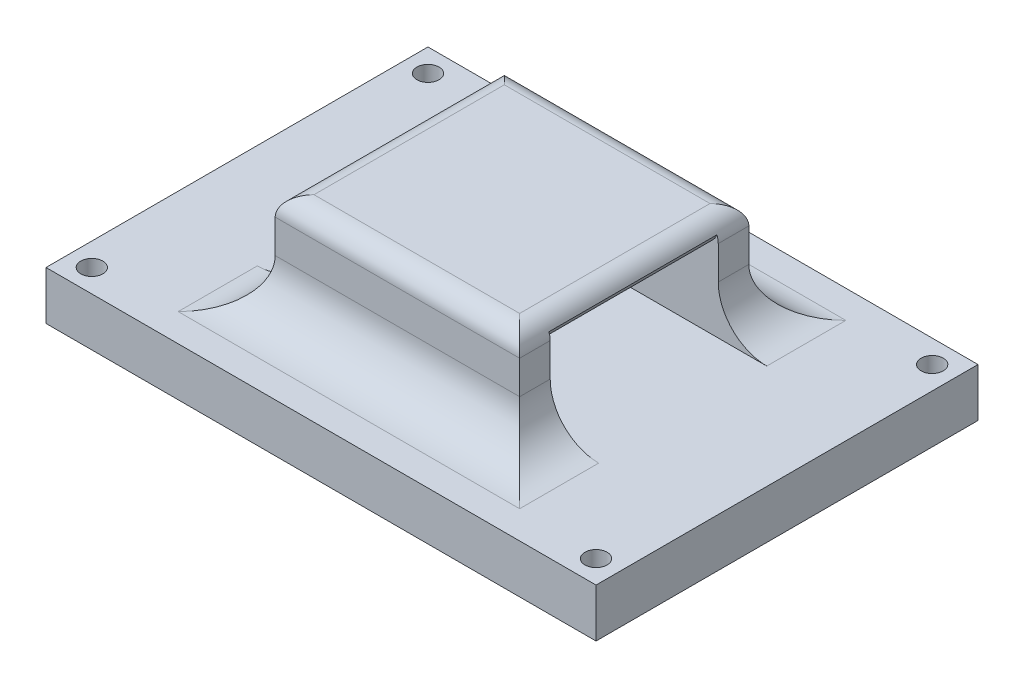
ISO-10303-21;
HEADER;
FILE_DESCRIPTION(('STEP AP214'),'2;1');
FILE_NAME('part.step','',(''),(''),'','','');
FILE_SCHEMA(('AUTOMOTIVE_DESIGN { 1 0 10303 214 1 1 1 1 }'));
ENDSEC;
DATA;
#1=APPLICATION_CONTEXT('core data for automotive mechanical design processes');
#2=APPLICATION_PROTOCOL_DEFINITION('international standard','automotive_design',2000,#1);
#3=PRODUCT_CONTEXT('',#1,'mechanical');
#4=PRODUCT('Part','Part','',(#3));
#5=PRODUCT_RELATED_PRODUCT_CATEGORY('part','',(#4));
#6=PRODUCT_DEFINITION_FORMATION('','',#4);
#7=PRODUCT_DEFINITION_CONTEXT('part definition',#1,'design');
#8=PRODUCT_DEFINITION('design','',#6,#7);
#9=PRODUCT_DEFINITION_SHAPE('','',#8);
#10=(LENGTH_UNIT() NAMED_UNIT(*) SI_UNIT(.MILLI.,.METRE.));
#11=(NAMED_UNIT(*) PLANE_ANGLE_UNIT() SI_UNIT($,.RADIAN.));
#12=(NAMED_UNIT(*) SI_UNIT($,.STERADIAN.) SOLID_ANGLE_UNIT());
#13=UNCERTAINTY_MEASURE_WITH_UNIT(LENGTH_MEASURE(1.E-05),#10,'distance_accuracy_value','');
#14=(GEOMETRIC_REPRESENTATION_CONTEXT(3) GLOBAL_UNCERTAINTY_ASSIGNED_CONTEXT((#13)) GLOBAL_UNIT_ASSIGNED_CONTEXT((#10,
#11,#12)) REPRESENTATION_CONTEXT('',''));
#15=CARTESIAN_POINT('',(0.,0.,0.));
#16=DIRECTION('',(0.,0.,1.));
#17=DIRECTION('',(1.,0.,0.));
#18=AXIS2_PLACEMENT_3D('',#15,#16,#17);
#19=CARTESIAN_POINT('',(32.,0.,0.));
#20=DIRECTION('',(-1.,0.,0.));
#21=DIRECTION('',(0.,0.,1.));
#22=AXIS2_PLACEMENT_3D('',#19,#20,#21);
#23=PLANE('',#22);
#24=DIRECTION('',(0.,-1.,0.));
#25=VECTOR('',#24,1.);
#26=CARTESIAN_POINT('',(32.,-5.,11.));
#27=LINE('',#26,#25);
#28=CARTESIAN_POINT('',(32.,5.71,11.));
#29=VERTEX_POINT('',#28);
#30=CARTESIAN_POINT('',(32.,1.35,11.));
#31=VERTEX_POINT('',#30);
#32=EDGE_CURVE('E55',#29,#31,#27,.T.);
#33=ORIENTED_EDGE('',*,*,#32,.F.);
#34=DIRECTION('',(0.,0.,1.));
#35=VECTOR('',#34,1.);
#36=CARTESIAN_POINT('',(32.,5.71,0.));
#37=LINE('',#36,#35);
#38=CARTESIAN_POINT('',(32.,5.71,15.));
#39=VERTEX_POINT('',#38);
#40=EDGE_CURVE('E347',#29,#39,#37,.T.);
#41=ORIENTED_EDGE('',*,*,#40,.T.);
#42=DIRECTION('',(0.,-1.,0.));
#43=VECTOR('',#42,1.);
#44=CARTESIAN_POINT('',(32.,-11.35,15.));
#45=LINE('',#44,#43);
#46=CARTESIAN_POINT('',(32.,1.35,15.));
#47=VERTEX_POINT('',#46);
#48=EDGE_CURVE('E267',#39,#47,#45,.T.);
#49=ORIENTED_EDGE('',*,*,#48,.T.);
#50=DIRECTION('',(0.,0.,-1.));
#51=VECTOR('',#50,1.);
#52=CARTESIAN_POINT('',(32.,1.35,0.));
#53=LINE('',#52,#51);
#54=EDGE_CURVE('E292',#47,#31,#53,.T.);
#55=ORIENTED_EDGE('',*,*,#54,.T.);
#56=EDGE_LOOP('',(#33,#41,#49,#55));
#57=FACE_BOUND('',#56,.T.);
#58=ADVANCED_FACE('F39',(#57),#23,.F.);
#59=CARTESIAN_POINT('',(0.,0.,0.));
#60=DIRECTION('',(-1.,0.,0.));
#61=DIRECTION('',(0.,0.,1.));
#62=AXIS2_PLACEMENT_3D('',#59,#60,#61);
#63=PLANE('',#62);
#64=DIRECTION('',(0.,0.,1.));
#65=VECTOR('',#64,1.);
#66=CARTESIAN_POINT('',(0.,5.71,-15.));
#67=LINE('',#66,#65);
#68=CARTESIAN_POINT('',(0.,5.71,15.));
#69=VERTEX_POINT('',#68);
#70=CARTESIAN_POINT('',(0.,5.71,11.));
#71=VERTEX_POINT('',#70);
#72=EDGE_CURVE('E386',#69,#71,#67,.F.);
#73=ORIENTED_EDGE('',*,*,#72,.T.);
#74=DIRECTION('',(0.,-1.,0.));
#75=VECTOR('',#74,1.);
#76=CARTESIAN_POINT('',(0.,-5.,11.));
#77=LINE('',#76,#75);
#78=CARTESIAN_POINT('',(0.,1.35,11.));
#79=VERTEX_POINT('',#78);
#80=EDGE_CURVE('E240',#71,#79,#77,.T.);
#81=ORIENTED_EDGE('',*,*,#80,.T.);
#82=DIRECTION('',(0.,0.,-1.));
#83=VECTOR('',#82,1.);
#84=CARTESIAN_POINT('',(0.,1.35,15.));
#85=LINE('',#84,#83);
#86=CARTESIAN_POINT('',(0.,1.35,15.));
#87=VERTEX_POINT('',#86);
#88=EDGE_CURVE('E322',#79,#87,#85,.F.);
#89=ORIENTED_EDGE('',*,*,#88,.T.);
#90=DIRECTION('',(0.,-1.,0.));
#91=VECTOR('',#90,1.);
#92=CARTESIAN_POINT('',(0.,-11.35,15.));
#93=LINE('',#92,#91);
#94=EDGE_CURVE('E268',#69,#87,#93,.T.);
#95=ORIENTED_EDGE('',*,*,#94,.F.);
#96=EDGE_LOOP('',(#73,#81,#89,#95));
#97=FACE_BOUND('',#96,.T.);
#98=ADVANCED_FACE('F502',(#97),#63,.T.);
#99=CARTESIAN_POINT('',(49.000000014,-15.451219330882,-21.999994072));
#100=DIRECTION('',(0.,1.,0.));
#101=DIRECTION('',(0.,0.,1.));
#102=AXIS2_PLACEMENT_3D('',#99,#100,#101);
#103=CYLINDRICAL_SURFACE('',#102,1.45);
#104=CARTESIAN_POINT('',(49.000000014,-11.35,-21.999994072));
#105=DIRECTION('',(0.,1.,0.));
#106=DIRECTION('',(0.,0.,1.));
#107=AXIS2_PLACEMENT_3D('',#104,#105,#106);
#108=CIRCLE('',#107,1.45);
#109=CARTESIAN_POINT('',(49.000000014,-11.35,-20.549994072));
#110=VERTEX_POINT('',#109);
#111=EDGE_CURVE('E284',#110,#110,#108,.F.);
#112=ORIENTED_EDGE('',*,*,#111,.T.);
#113=EDGE_LOOP('',(#112));
#114=FACE_BOUND('',#113,.T.);
#115=CARTESIAN_POINT('',(49.000000014,-5.,-21.999994072));
#116=DIRECTION('',(0.,1.,0.));
#117=DIRECTION('',(0.,0.,1.));
#118=AXIS2_PLACEMENT_3D('',#115,#116,#117);
#119=CIRCLE('',#118,1.45);
#120=CARTESIAN_POINT('',(49.000000014,-5.,-20.549994072));
#121=VERTEX_POINT('',#120);
#122=EDGE_CURVE('E288',#121,#121,#119,.T.);
#123=ORIENTED_EDGE('',*,*,#122,.T.);
#124=EDGE_LOOP('',(#123));
#125=FACE_BOUND('',#124,.T.);
#126=ADVANCED_FACE('F551',(#114,#125),#103,.F.);
#127=CARTESIAN_POINT('',(-17.,-15.451219330882,-21.999994072));
#128=DIRECTION('',(0.,1.,0.));
#129=DIRECTION('',(0.,0.,1.));
#130=AXIS2_PLACEMENT_3D('',#127,#128,#129);
#131=CYLINDRICAL_SURFACE('',#130,1.45);
#132=CARTESIAN_POINT('',(-17.,-11.35,-21.999994072));
#133=DIRECTION('',(0.,1.,0.));
#134=DIRECTION('',(0.,0.,1.));
#135=AXIS2_PLACEMENT_3D('',#132,#133,#134);
#136=CIRCLE('',#135,1.45);
#137=CARTESIAN_POINT('',(-17.,-11.35,-20.549994072));
#138=VERTEX_POINT('',#137);
#139=EDGE_CURVE('E271',#138,#138,#136,.F.);
#140=ORIENTED_EDGE('',*,*,#139,.T.);
#141=EDGE_LOOP('',(#140));
#142=FACE_BOUND('',#141,.T.);
#143=CARTESIAN_POINT('',(-17.,-5.,-21.999994072));
#144=DIRECTION('',(0.,1.,0.));
#145=DIRECTION('',(0.,0.,1.));
#146=AXIS2_PLACEMENT_3D('',#143,#144,#145);
#147=CIRCLE('',#146,1.45);
#148=CARTESIAN_POINT('',(-17.,-5.,-20.549994072));
#149=VERTEX_POINT('',#148);
#150=EDGE_CURVE('E280',#149,#149,#147,.T.);
#151=ORIENTED_EDGE('',*,*,#150,.T.);
#152=EDGE_LOOP('',(#151));
#153=FACE_BOUND('',#152,.T.);
#154=ADVANCED_FACE('F555',(#142,#153),#131,.F.);
#155=CARTESIAN_POINT('',(32.,5.71,-15.));
#156=VERTEX_POINT('',#155);
#157=CARTESIAN_POINT('',(32.,5.71,-11.));
#158=VERTEX_POINT('',#157);
#159=EDGE_CURVE('E365',#156,#158,#37,.T.);
#160=ORIENTED_EDGE('',*,*,#159,.T.);
#161=DIRECTION('',(0.,1.,0.));
#162=VECTOR('',#161,1.);
#163=CARTESIAN_POINT('',(32.,-5.,-11.));
#164=LINE('',#163,#162);
#165=CARTESIAN_POINT('',(32.,1.35,-11.));
#166=VERTEX_POINT('',#165);
#167=EDGE_CURVE('E237',#166,#158,#164,.T.);
#168=ORIENTED_EDGE('',*,*,#167,.F.);
#169=DIRECTION('',(0.,0.,-1.));
#170=VECTOR('',#169,1.);
#171=CARTESIAN_POINT('',(32.,1.35,0.));
#172=LINE('',#171,#170);
#173=CARTESIAN_POINT('',(32.,1.35,-15.));
#174=VERTEX_POINT('',#173);
#175=EDGE_CURVE('E295',#166,#174,#172,.T.);
#176=ORIENTED_EDGE('',*,*,#175,.T.);
#177=DIRECTION('',(0.,1.,0.));
#178=VECTOR('',#177,1.);
#179=CARTESIAN_POINT('',(32.,-11.35,-15.));
#180=LINE('',#179,#178);
#181=EDGE_CURVE('E263',#174,#156,#180,.T.);
#182=ORIENTED_EDGE('',*,*,#181,.T.);
#183=EDGE_LOOP('',(#160,#168,#176,#182));
#184=FACE_BOUND('',#183,.T.);
#185=ADVANCED_FACE('F515',(#184),#23,.F.);
#186=DIRECTION('',(0.,1.,0.));
#187=VECTOR('',#186,1.);
#188=CARTESIAN_POINT('',(0.,-5.,-11.));
#189=LINE('',#188,#187);
#190=CARTESIAN_POINT('',(0.,1.35,-11.));
#191=VERTEX_POINT('',#190);
#192=CARTESIAN_POINT('',(0.,5.71,-11.));
#193=VERTEX_POINT('',#192);
#194=EDGE_CURVE('E63',#191,#193,#189,.T.);
#195=ORIENTED_EDGE('',*,*,#194,.T.);
#196=CARTESIAN_POINT('',(0.,5.71,-15.));
#197=VERTEX_POINT('',#196);
#198=EDGE_CURVE('E385',#193,#197,#67,.F.);
#199=ORIENTED_EDGE('',*,*,#198,.T.);
#200=DIRECTION('',(0.,1.,0.));
#201=VECTOR('',#200,1.);
#202=CARTESIAN_POINT('',(0.,-11.35,-15.));
#203=LINE('',#202,#201);
#204=CARTESIAN_POINT('',(0.,1.35,-15.));
#205=VERTEX_POINT('',#204);
#206=EDGE_CURVE('E262',#205,#197,#203,.T.);
#207=ORIENTED_EDGE('',*,*,#206,.F.);
#208=DIRECTION('',(0.,0.,-1.));
#209=VECTOR('',#208,1.);
#210=CARTESIAN_POINT('',(0.,1.35,-11.));
#211=LINE('',#210,#209);
#212=EDGE_CURVE('E319',#205,#191,#211,.F.);
#213=ORIENTED_EDGE('',*,*,#212,.T.);
#214=EDGE_LOOP('',(#195,#199,#207,#213));
#215=FACE_BOUND('',#214,.T.);
#216=ADVANCED_FACE('F529',(#215),#63,.T.);
#217=CARTESIAN_POINT('',(32.,-11.35,-15.));
#218=DIRECTION('',(0.,0.,1.));
#219=DIRECTION('',(1.,0.,0.));
#220=AXIS2_PLACEMENT_3D('',#217,#218,#219);
#221=PLANE('',#220);
#222=ORIENTED_EDGE('',*,*,#206,.T.);
#223=DIRECTION('',(-1.,0.,0.));
#224=VECTOR('',#223,1.);
#225=CARTESIAN_POINT('',(32.,5.71,-15.));
#226=LINE('',#225,#224);
#227=EDGE_CURVE('E382',#197,#156,#226,.F.);
#228=ORIENTED_EDGE('',*,*,#227,.T.);
#229=ORIENTED_EDGE('',*,*,#181,.F.);
#230=DIRECTION('',(-1.,0.,0.));
#231=VECTOR('',#230,1.);
#232=CARTESIAN_POINT('',(32.,1.35,-15.));
#233=LINE('',#232,#231);
#234=EDGE_CURVE('E326',#174,#205,#233,.T.);
#235=ORIENTED_EDGE('',*,*,#234,.T.);
#236=EDGE_LOOP('',(#222,#228,#229,#235));
#237=FACE_BOUND('',#236,.T.);
#238=ADVANCED_FACE('F513',(#237),#221,.F.);
#239=CARTESIAN_POINT('',(32.,8.25,15.));
#240=DIRECTION('',(0.,-1.,0.));
#241=DIRECTION('',(0.,0.,-1.));
#242=AXIS2_PLACEMENT_3D('',#239,#240,#241);
#243=PLANE('',#242);
#244=DIRECTION('',(-1.,0.,0.));
#245=VECTOR('',#244,1.);
#246=CARTESIAN_POINT('',(32.,8.25,12.46));
#247=LINE('',#246,#245);
#248=CARTESIAN_POINT('',(2.54,8.25,12.46));
#249=VERTEX_POINT('',#248);
#250=CARTESIAN_POINT('',(29.46,8.25,12.46));
#251=VERTEX_POINT('',#250);
#252=EDGE_CURVE('E369',#249,#251,#247,.F.);
#253=ORIENTED_EDGE('',*,*,#252,.T.);
#254=DIRECTION('',(0.,0.,1.));
#255=VECTOR('',#254,1.);
#256=CARTESIAN_POINT('',(29.46,8.25,15.));
#257=LINE('',#256,#255);
#258=CARTESIAN_POINT('',(29.46,8.25,-12.46));
#259=VERTEX_POINT('',#258);
#260=EDGE_CURVE('E378',#251,#259,#257,.F.);
#261=ORIENTED_EDGE('',*,*,#260,.T.);
#262=DIRECTION('',(-1.,0.,0.));
#263=VECTOR('',#262,1.);
#264=CARTESIAN_POINT('',(32.,8.25,-12.46));
#265=LINE('',#264,#263);
#266=CARTESIAN_POINT('',(2.54,8.25,-12.46));
#267=VERTEX_POINT('',#266);
#268=EDGE_CURVE('E375',#259,#267,#265,.T.);
#269=ORIENTED_EDGE('',*,*,#268,.T.);
#270=DIRECTION('',(0.,0.,1.));
#271=VECTOR('',#270,1.);
#272=CARTESIAN_POINT('',(2.54,8.25,15.));
#273=LINE('',#272,#271);
#274=EDGE_CURVE('E372',#267,#249,#273,.T.);
#275=ORIENTED_EDGE('',*,*,#274,.T.);
#276=EDGE_LOOP('',(#253,#261,#269,#275));
#277=FACE_BOUND('',#276,.T.);
#278=ADVANCED_FACE('F505',(#277),#243,.F.);
#279=CARTESIAN_POINT('',(32.,-11.35,15.));
#280=DIRECTION('',(0.,0.,-1.));
#281=DIRECTION('',(-1.,0.,0.));
#282=AXIS2_PLACEMENT_3D('',#279,#280,#281);
#283=PLANE('',#282);
#284=ORIENTED_EDGE('',*,*,#48,.F.);
#285=DIRECTION('',(-1.,0.,0.));
#286=VECTOR('',#285,1.);
#287=CARTESIAN_POINT('',(32.,5.71,15.));
#288=LINE('',#287,#286);
#289=EDGE_CURVE('E390',#39,#69,#288,.T.);
#290=ORIENTED_EDGE('',*,*,#289,.T.);
#291=ORIENTED_EDGE('',*,*,#94,.T.);
#292=DIRECTION('',(1.,0.,0.));
#293=VECTOR('',#292,1.);
#294=CARTESIAN_POINT('',(32.,1.35,15.));
#295=LINE('',#294,#293);
#296=EDGE_CURVE('E329',#87,#47,#295,.T.);
#297=ORIENTED_EDGE('',*,*,#296,.T.);
#298=EDGE_LOOP('',(#284,#290,#291,#297));
#299=FACE_BOUND('',#298,.T.);
#300=ADVANCED_FACE('F484',(#299),#283,.F.);
#301=CARTESIAN_POINT('',(32.,-5.,-11.));
#302=DIRECTION('',(0.,0.,1.));
#303=DIRECTION('',(1.,0.,0.));
#304=AXIS2_PLACEMENT_3D('',#301,#302,#303);
#305=PLANE('',#304);
#306=ORIENTED_EDGE('',*,*,#194,.F.);
#307=CARTESIAN_POINT('',(-6.35,1.35,-11.));
#308=DIRECTION('',(0.,0.,1.));
#309=DIRECTION('',(1.,0.,0.));
#310=AXIS2_PLACEMENT_3D('',#307,#308,#309);
#311=CIRCLE('',#310,6.35);
#312=CARTESIAN_POINT('',(-6.35,-5.,-11.));
#313=VERTEX_POINT('',#312);
#314=EDGE_CURVE('E343',#191,#313,#311,.F.);
#315=ORIENTED_EDGE('',*,*,#314,.T.);
#316=DIRECTION('',(-1.,0.,0.));
#317=VECTOR('',#316,1.);
#318=CARTESIAN_POINT('',(32.,-5.,-11.));
#319=LINE('',#318,#317);
#320=CARTESIAN_POINT('',(38.35,-5.,-11.));
#321=VERTEX_POINT('',#320);
#322=EDGE_CURVE('E243',#321,#313,#319,.T.);
#323=ORIENTED_EDGE('',*,*,#322,.F.);
#324=CARTESIAN_POINT('',(38.35,1.35,-11.));
#325=DIRECTION('',(0.,0.,1.));
#326=DIRECTION('',(1.,0.,0.));
#327=AXIS2_PLACEMENT_3D('',#324,#325,#326);
#328=CIRCLE('',#327,6.35);
#329=EDGE_CURVE('E333',#321,#166,#328,.F.);
#330=ORIENTED_EDGE('',*,*,#329,.T.);
#331=ORIENTED_EDGE('',*,*,#167,.T.);
#332=CARTESIAN_POINT('',(29.46,5.71,-11.));
#333=DIRECTION('',(0.,0.,1.));
#334=DIRECTION('',(1.,0.,0.));
#335=AXIS2_PLACEMENT_3D('',#332,#333,#334);
#336=CIRCLE('',#335,2.54);
#337=CARTESIAN_POINT('',(31.8294672396976,6.625,-11.));
#338=VERTEX_POINT('',#337);
#339=EDGE_CURVE('E431',#338,#158,#336,.F.);
#340=ORIENTED_EDGE('',*,*,#339,.F.);
#341=CARTESIAN_POINT('',(29.46,7.54,-11.));
#342=DIRECTION('',(0.,0.,1.));
#343=DIRECTION('',(1.,0.,0.));
#344=AXIS2_PLACEMENT_3D('',#341,#342,#343);
#345=CIRCLE('',#344,2.54);
#346=CARTESIAN_POINT('',(29.46,5.,-11.));
#347=VERTEX_POINT('',#346);
#348=EDGE_CURVE('E11',#338,#347,#345,.F.);
#349=ORIENTED_EDGE('',*,*,#348,.T.);
#350=DIRECTION('',(-1.,0.,0.));
#351=VECTOR('',#350,1.);
#352=CARTESIAN_POINT('',(32.,5.,-11.));
#353=LINE('',#352,#351);
#354=CARTESIAN_POINT('',(2.54,5.,-11.));
#355=VERTEX_POINT('',#354);
#356=EDGE_CURVE('E258',#347,#355,#353,.T.);
#357=ORIENTED_EDGE('',*,*,#356,.T.);
#358=CARTESIAN_POINT('',(2.54,7.54,-11.));
#359=DIRECTION('',(0.,0.,1.));
#360=DIRECTION('',(1.,0.,0.));
#361=AXIS2_PLACEMENT_3D('',#358,#359,#360);
#362=CIRCLE('',#361,2.54);
#363=CARTESIAN_POINT('',(0.170532760302435,6.625,-11.));
#364=VERTEX_POINT('',#363);
#365=EDGE_CURVE('E442',#355,#364,#362,.F.);
#366=ORIENTED_EDGE('',*,*,#365,.T.);
#367=CARTESIAN_POINT('',(2.54,5.71,-11.));
#368=DIRECTION('',(0.,0.,1.));
#369=DIRECTION('',(1.,0.,0.));
#370=AXIS2_PLACEMENT_3D('',#367,#368,#369);
#371=CIRCLE('',#370,2.54);
#372=EDGE_CURVE('E393',#193,#364,#371,.F.);
#373=ORIENTED_EDGE('',*,*,#372,.F.);
#374=EDGE_LOOP('',(#306,#315,#323,#330,#331,#340,#349,#357,#366,#373));
#375=FACE_BOUND('',#374,.T.);
#376=ADVANCED_FACE('F457',(#375),#305,.T.);
#377=CARTESIAN_POINT('',(32.,5.,11.));
#378=DIRECTION('',(0.,-1.,0.));
#379=DIRECTION('',(0.,0.,-1.));
#380=AXIS2_PLACEMENT_3D('',#377,#378,#379);
#381=PLANE('',#380);
#382=DIRECTION('',(-1.,0.,0.));
#383=VECTOR('',#382,1.);
#384=CARTESIAN_POINT('',(32.,5.,11.));
#385=LINE('',#384,#383);
#386=CARTESIAN_POINT('',(29.46,5.,11.));
#387=VERTEX_POINT('',#386);
#388=CARTESIAN_POINT('',(2.54,5.,11.));
#389=VERTEX_POINT('',#388);
#390=EDGE_CURVE('E254',#387,#389,#385,.T.);
#391=ORIENTED_EDGE('',*,*,#390,.T.);
#392=DIRECTION('',(0.,0.,1.));
#393=VECTOR('',#392,1.);
#394=CARTESIAN_POINT('',(2.54,5.,11.));
#395=LINE('',#394,#393);
#396=EDGE_CURVE('E423',#389,#355,#395,.F.);
#397=ORIENTED_EDGE('',*,*,#396,.T.);
#398=ORIENTED_EDGE('',*,*,#356,.F.);
#399=DIRECTION('',(0.,0.,1.));
#400=VECTOR('',#399,1.);
#401=CARTESIAN_POINT('',(29.46,5.,11.));
#402=LINE('',#401,#400);
#403=EDGE_CURVE('E419',#347,#387,#402,.T.);
#404=ORIENTED_EDGE('',*,*,#403,.T.);
#405=EDGE_LOOP('',(#391,#397,#398,#404));
#406=FACE_BOUND('',#405,.T.);
#407=ADVANCED_FACE('F459',(#406),#381,.T.);
#408=CARTESIAN_POINT('',(32.,-5.,11.));
#409=DIRECTION('',(0.,0.,-1.));
#410=DIRECTION('',(-1.,0.,0.));
#411=AXIS2_PLACEMENT_3D('',#408,#409,#410);
#412=PLANE('',#411);
#413=ORIENTED_EDGE('',*,*,#80,.F.);
#414=CARTESIAN_POINT('',(2.54,5.71,11.));
#415=DIRECTION('',(0.,0.,-1.));
#416=DIRECTION('',(-1.,0.,0.));
#417=AXIS2_PLACEMENT_3D('',#414,#415,#416);
#418=CIRCLE('',#417,2.54);
#419=CARTESIAN_POINT('',(0.170532760302435,6.625,11.));
#420=VERTEX_POINT('',#419);
#421=EDGE_CURVE('E415',#420,#71,#418,.F.);
#422=ORIENTED_EDGE('',*,*,#421,.F.);
#423=CARTESIAN_POINT('',(2.54,7.54,11.));
#424=DIRECTION('',(0.,0.,-1.));
#425=DIRECTION('',(-1.,0.,0.));
#426=AXIS2_PLACEMENT_3D('',#423,#424,#425);
#427=CIRCLE('',#426,2.54);
#428=EDGE_CURVE('E439',#420,#389,#427,.F.);
#429=ORIENTED_EDGE('',*,*,#428,.T.);
#430=ORIENTED_EDGE('',*,*,#390,.F.);
#431=CARTESIAN_POINT('',(29.46,7.54,11.));
#432=DIRECTION('',(0.,0.,-1.));
#433=DIRECTION('',(-1.,0.,0.));
#434=AXIS2_PLACEMENT_3D('',#431,#432,#433);
#435=CIRCLE('',#434,2.54);
#436=CARTESIAN_POINT('',(31.8294672396976,6.625,11.));
#437=VERTEX_POINT('',#436);
#438=EDGE_CURVE('E48',#387,#437,#435,.F.);
#439=ORIENTED_EDGE('',*,*,#438,.T.);
#440=CARTESIAN_POINT('',(29.46,5.71,11.));
#441=DIRECTION('',(0.,0.,-1.));
#442=DIRECTION('',(-1.,0.,0.));
#443=AXIS2_PLACEMENT_3D('',#440,#441,#442);
#444=CIRCLE('',#443,2.54);
#445=EDGE_CURVE('E435',#29,#437,#444,.F.);
#446=ORIENTED_EDGE('',*,*,#445,.F.);
#447=ORIENTED_EDGE('',*,*,#32,.T.);
#448=CARTESIAN_POINT('',(38.35,1.35,11.));
#449=DIRECTION('',(0.,0.,-1.));
#450=DIRECTION('',(-1.,0.,0.));
#451=AXIS2_PLACEMENT_3D('',#448,#449,#450);
#452=CIRCLE('',#451,6.35);
#453=CARTESIAN_POINT('',(38.35,-5.,11.));
#454=VERTEX_POINT('',#453);
#455=EDGE_CURVE('E336',#31,#454,#452,.F.);
#456=ORIENTED_EDGE('',*,*,#455,.T.);
#457=DIRECTION('',(-1.,0.,0.));
#458=VECTOR('',#457,1.);
#459=CARTESIAN_POINT('',(32.,-5.,11.));
#460=LINE('',#459,#458);
#461=CARTESIAN_POINT('',(-6.35,-5.,11.));
#462=VERTEX_POINT('',#461);
#463=EDGE_CURVE('E251',#454,#462,#460,.T.);
#464=ORIENTED_EDGE('',*,*,#463,.T.);
#465=CARTESIAN_POINT('',(-6.35,1.35,11.));
#466=DIRECTION('',(0.,0.,-1.));
#467=DIRECTION('',(-1.,0.,0.));
#468=AXIS2_PLACEMENT_3D('',#465,#466,#467);
#469=CIRCLE('',#468,6.35);
#470=EDGE_CURVE('E340',#462,#79,#469,.F.);
#471=ORIENTED_EDGE('',*,*,#470,.T.);
#472=EDGE_LOOP('',(#413,#422,#429,#430,#439,#446,#447,#456,#464,#471));
#473=FACE_BOUND('',#472,.T.);
#474=ADVANCED_FACE('F447',(#473),#412,.T.);
#475=CARTESIAN_POINT('',(32.,-5.,11.));
#476=DIRECTION('',(0.,1.,0.));
#477=DIRECTION('',(0.,0.,1.));
#478=AXIS2_PLACEMENT_3D('',#475,#476,#477);
#479=PLANE('',#478);
#480=CARTESIAN_POINT('',(49.000000014,-5.,22.000006));
#481=DIRECTION('',(0.,1.,0.));
#482=DIRECTION('',(0.,0.,1.));
#483=AXIS2_PLACEMENT_3D('',#480,#481,#482);
#484=CIRCLE('',#483,1.45);
#485=CARTESIAN_POINT('',(49.000000014,-5.,23.450006));
#486=VERTEX_POINT('',#485);
#487=EDGE_CURVE('E824',#486,#486,#484,.T.);
#488=ORIENTED_EDGE('',*,*,#487,.F.);
#489=EDGE_LOOP('',(#488));
#490=FACE_BOUND('',#489,.T.);
#491=CARTESIAN_POINT('',(-17.,-5.,22.000006));
#492=DIRECTION('',(0.,1.,0.));
#493=DIRECTION('',(0.,0.,1.));
#494=AXIS2_PLACEMENT_3D('',#491,#492,#493);
#495=CIRCLE('',#494,1.45);
#496=CARTESIAN_POINT('',(-17.,-5.,23.450006));
#497=VERTEX_POINT('',#496);
#498=EDGE_CURVE('E820',#497,#497,#495,.T.);
#499=ORIENTED_EDGE('',*,*,#498,.F.);
#500=EDGE_LOOP('',(#499));
#501=FACE_BOUND('',#500,.T.);
#502=DIRECTION('',(0.,0.,-1.));
#503=VECTOR('',#502,1.);
#504=CARTESIAN_POINT('',(38.35,-5.,11.));
#505=LINE('',#504,#503);
#506=CARTESIAN_POINT('',(38.35,-5.,-21.35));
#507=VERTEX_POINT('',#506);
#508=EDGE_CURVE('E315',#507,#321,#505,.F.);
#509=ORIENTED_EDGE('',*,*,#508,.T.);
#510=ORIENTED_EDGE('',*,*,#322,.T.);
#511=DIRECTION('',(0.,0.,-1.));
#512=VECTOR('',#511,1.);
#513=CARTESIAN_POINT('',(-6.35,-5.,-15.));
#514=LINE('',#513,#512);
#515=CARTESIAN_POINT('',(-6.35,-5.,-21.35));
#516=VERTEX_POINT('',#515);
#517=EDGE_CURVE('E312',#313,#516,#514,.T.);
#518=ORIENTED_EDGE('',*,*,#517,.T.);
#519=DIRECTION('',(-1.,0.,0.));
#520=VECTOR('',#519,1.);
#521=CARTESIAN_POINT('',(32.,-5.,-21.35));
#522=LINE('',#521,#520);
#523=EDGE_CURVE('E309',#516,#507,#522,.F.);
#524=ORIENTED_EDGE('',*,*,#523,.T.);
#525=EDGE_LOOP('',(#509,#510,#518,#524));
#526=FACE_BOUND('',#525,.T.);
#527=DIRECTION('',(0.,0.,-1.));
#528=VECTOR('',#527,1.);
#529=CARTESIAN_POINT('',(-6.35,-5.,11.));
#530=LINE('',#529,#528);
#531=CARTESIAN_POINT('',(-6.35,-5.,21.35));
#532=VERTEX_POINT('',#531);
#533=EDGE_CURVE('E302',#532,#462,#530,.T.);
#534=ORIENTED_EDGE('',*,*,#533,.T.);
#535=ORIENTED_EDGE('',*,*,#463,.F.);
#536=DIRECTION('',(0.,0.,-1.));
#537=VECTOR('',#536,1.);
#538=CARTESIAN_POINT('',(38.35,-5.,11.));
#539=LINE('',#538,#537);
#540=CARTESIAN_POINT('',(38.35,-5.,21.35));
#541=VERTEX_POINT('',#540);
#542=EDGE_CURVE('E306',#454,#541,#539,.F.);
#543=ORIENTED_EDGE('',*,*,#542,.T.);
#544=DIRECTION('',(1.,0.,0.));
#545=VECTOR('',#544,1.);
#546=CARTESIAN_POINT('',(32.,-5.,21.35));
#547=LINE('',#546,#545);
#548=EDGE_CURVE('E299',#541,#532,#547,.F.);
#549=ORIENTED_EDGE('',*,*,#548,.T.);
#550=EDGE_LOOP('',(#534,#535,#543,#549));
#551=FACE_BOUND('',#550,.T.);
#552=DIRECTION('',(0.,0.,-1.));
#553=VECTOR('',#552,1.);
#554=CARTESIAN_POINT('',(-20.,-5.,-25.));
#555=LINE('',#554,#553);
#556=CARTESIAN_POINT('',(-20.,-5.,25.));
#557=VERTEX_POINT('',#556);
#558=CARTESIAN_POINT('',(-20.,-5.,-25.));
#559=VERTEX_POINT('',#558);
#560=EDGE_CURVE('E225',#557,#559,#555,.T.);
#561=ORIENTED_EDGE('',*,*,#560,.F.);
#562=DIRECTION('',(-1.,0.,0.));
#563=VECTOR('',#562,1.);
#564=CARTESIAN_POINT('',(-20.,-5.,25.));
#565=LINE('',#564,#563);
#566=CARTESIAN_POINT('',(52.,-5.,25.));
#567=VERTEX_POINT('',#566);
#568=EDGE_CURVE('E196',#567,#557,#565,.T.);
#569=ORIENTED_EDGE('',*,*,#568,.F.);
#570=DIRECTION('',(0.,0.,1.));
#571=VECTOR('',#570,1.);
#572=CARTESIAN_POINT('',(52.,-5.,-25.));
#573=LINE('',#572,#571);
#574=CARTESIAN_POINT('',(52.,-5.,-25.));
#575=VERTEX_POINT('',#574);
#576=EDGE_CURVE('E188',#575,#567,#573,.T.);
#577=ORIENTED_EDGE('',*,*,#576,.F.);
#578=DIRECTION('',(1.,0.,0.));
#579=VECTOR('',#578,1.);
#580=CARTESIAN_POINT('',(-20.,-5.,-25.));
#581=LINE('',#580,#579);
#582=EDGE_CURVE('E193',#559,#575,#581,.T.);
#583=ORIENTED_EDGE('',*,*,#582,.F.);
#584=EDGE_LOOP('',(#561,#569,#577,#583));
#585=FACE_BOUND('',#584,.T.);
#586=ORIENTED_EDGE('',*,*,#150,.F.);
#587=EDGE_LOOP('',(#586));
#588=FACE_BOUND('',#587,.T.);
#589=ORIENTED_EDGE('',*,*,#122,.F.);
#590=EDGE_LOOP('',(#589));
#591=FACE_BOUND('',#590,.T.);
#592=ADVANCED_FACE('F190',(#490,#501,#526,#551,#585,#588,#591),#479,.T.);
#593=CARTESIAN_POINT('',(-20.,82.6584280032445,-25.));
#594=DIRECTION('',(0.,0.,-1.));
#595=DIRECTION('',(-1.,0.,0.));
#596=AXIS2_PLACEMENT_3D('',#593,#594,#595);
#597=PLANE('',#596);
#598=DIRECTION('',(0.,-1.,0.));
#599=VECTOR('',#598,1.);
#600=CARTESIAN_POINT('',(-20.,82.6584280032445,-25.));
#601=LINE('',#600,#599);
#602=CARTESIAN_POINT('',(-20.,-11.35,-25.));
#603=VERTEX_POINT('',#602);
#604=EDGE_CURVE('E214',#559,#603,#601,.T.);
#605=ORIENTED_EDGE('',*,*,#604,.F.);
#606=ORIENTED_EDGE('',*,*,#582,.T.);
#607=DIRECTION('',(0.,-1.,0.));
#608=VECTOR('',#607,1.);
#609=CARTESIAN_POINT('',(52.,82.6584280032445,-25.));
#610=LINE('',#609,#608);
#611=CARTESIAN_POINT('',(52.,-11.35,-25.));
#612=VERTEX_POINT('',#611);
#613=EDGE_CURVE('E201',#575,#612,#610,.T.);
#614=ORIENTED_EDGE('',*,*,#613,.T.);
#615=DIRECTION('',(1.,0.,0.));
#616=VECTOR('',#615,1.);
#617=CARTESIAN_POINT('',(-20.,-11.35,-25.));
#618=LINE('',#617,#616);
#619=EDGE_CURVE('E811',#603,#612,#618,.T.);
#620=ORIENTED_EDGE('',*,*,#619,.F.);
#621=EDGE_LOOP('',(#605,#606,#614,#620));
#622=FACE_BOUND('',#621,.T.);
#623=ADVANCED_FACE('F213',(#622),#597,.T.);
#624=CARTESIAN_POINT('',(52.,82.6584280032445,-25.));
#625=DIRECTION('',(1.,0.,0.));
#626=DIRECTION('',(0.,0.,-1.));
#627=AXIS2_PLACEMENT_3D('',#624,#625,#626);
#628=PLANE('',#627);
#629=ORIENTED_EDGE('',*,*,#613,.F.);
#630=ORIENTED_EDGE('',*,*,#576,.T.);
#631=DIRECTION('',(0.,-1.,0.));
#632=VECTOR('',#631,1.);
#633=CARTESIAN_POINT('',(52.,82.6584280032445,25.));
#634=LINE('',#633,#632);
#635=CARTESIAN_POINT('',(52.,-11.35,25.));
#636=VERTEX_POINT('',#635);
#637=EDGE_CURVE('E200',#567,#636,#634,.T.);
#638=ORIENTED_EDGE('',*,*,#637,.T.);
#639=DIRECTION('',(0.,0.,1.));
#640=VECTOR('',#639,1.);
#641=CARTESIAN_POINT('',(52.,-11.35,-25.));
#642=LINE('',#641,#640);
#643=EDGE_CURVE('E206',#612,#636,#642,.T.);
#644=ORIENTED_EDGE('',*,*,#643,.F.);
#645=EDGE_LOOP('',(#629,#630,#638,#644));
#646=FACE_BOUND('',#645,.T.);
#647=ADVANCED_FACE('F204',(#646),#628,.T.);
#648=CARTESIAN_POINT('',(-20.,82.6584280032445,25.));
#649=DIRECTION('',(0.,0.,1.));
#650=DIRECTION('',(1.,0.,0.));
#651=AXIS2_PLACEMENT_3D('',#648,#649,#650);
#652=PLANE('',#651);
#653=ORIENTED_EDGE('',*,*,#637,.F.);
#654=ORIENTED_EDGE('',*,*,#568,.T.);
#655=DIRECTION('',(0.,-1.,0.));
#656=VECTOR('',#655,1.);
#657=CARTESIAN_POINT('',(-20.,82.6584280032445,25.));
#658=LINE('',#657,#656);
#659=CARTESIAN_POINT('',(-20.,-11.35,25.));
#660=VERTEX_POINT('',#659);
#661=EDGE_CURVE('E228',#557,#660,#658,.T.);
#662=ORIENTED_EDGE('',*,*,#661,.T.);
#663=DIRECTION('',(-1.,0.,0.));
#664=VECTOR('',#663,1.);
#665=CARTESIAN_POINT('',(-20.,-11.35,25.));
#666=LINE('',#665,#664);
#667=EDGE_CURVE('E216',#636,#660,#666,.T.);
#668=ORIENTED_EDGE('',*,*,#667,.F.);
#669=EDGE_LOOP('',(#653,#654,#662,#668));
#670=FACE_BOUND('',#669,.T.);
#671=ADVANCED_FACE('F780',(#670),#652,.T.);
#672=CARTESIAN_POINT('',(-20.,82.6584280032445,-25.));
#673=DIRECTION('',(-1.,0.,0.));
#674=DIRECTION('',(0.,0.,1.));
#675=AXIS2_PLACEMENT_3D('',#672,#673,#674);
#676=PLANE('',#675);
#677=ORIENTED_EDGE('',*,*,#661,.F.);
#678=ORIENTED_EDGE('',*,*,#560,.T.);
#679=ORIENTED_EDGE('',*,*,#604,.T.);
#680=DIRECTION('',(0.,0.,-1.));
#681=VECTOR('',#680,1.);
#682=CARTESIAN_POINT('',(-20.,-11.35,-25.));
#683=LINE('',#682,#681);
#684=EDGE_CURVE('E223',#660,#603,#683,.T.);
#685=ORIENTED_EDGE('',*,*,#684,.F.);
#686=EDGE_LOOP('',(#677,#678,#679,#685));
#687=FACE_BOUND('',#686,.T.);
#688=ADVANCED_FACE('F752',(#687),#676,.T.);
#689=CARTESIAN_POINT('',(32.,-11.35,15.));
#690=DIRECTION('',(0.,1.,0.));
#691=DIRECTION('',(0.,0.,1.));
#692=AXIS2_PLACEMENT_3D('',#689,#690,#691);
#693=PLANE('',#692);
#694=CARTESIAN_POINT('',(49.000000014,-11.35,22.000006));
#695=DIRECTION('',(0.,1.,0.));
#696=DIRECTION('',(0.,0.,1.));
#697=AXIS2_PLACEMENT_3D('',#694,#695,#696);
#698=CIRCLE('',#697,1.45);
#699=CARTESIAN_POINT('',(49.000000014,-11.35,23.450006));
#700=VERTEX_POINT('',#699);
#701=EDGE_CURVE('E356',#700,#700,#698,.F.);
#702=ORIENTED_EDGE('',*,*,#701,.F.);
#703=EDGE_LOOP('',(#702));
#704=FACE_BOUND('',#703,.T.);
#705=CARTESIAN_POINT('',(-17.,-11.35,22.000006));
#706=DIRECTION('',(0.,1.,0.));
#707=DIRECTION('',(0.,0.,1.));
#708=AXIS2_PLACEMENT_3D('',#705,#706,#707);
#709=CIRCLE('',#708,1.45);
#710=CARTESIAN_POINT('',(-17.,-11.35,23.450006));
#711=VERTEX_POINT('',#710);
#712=EDGE_CURVE('E816',#711,#711,#709,.F.);
#713=ORIENTED_EDGE('',*,*,#712,.F.);
#714=EDGE_LOOP('',(#713));
#715=FACE_BOUND('',#714,.T.);
#716=ORIENTED_EDGE('',*,*,#684,.T.);
#717=ORIENTED_EDGE('',*,*,#619,.T.);
#718=ORIENTED_EDGE('',*,*,#643,.T.);
#719=ORIENTED_EDGE('',*,*,#667,.T.);
#720=EDGE_LOOP('',(#716,#717,#718,#719));
#721=FACE_BOUND('',#720,.T.);
#722=ORIENTED_EDGE('',*,*,#139,.F.);
#723=EDGE_LOOP('',(#722));
#724=FACE_BOUND('',#723,.T.);
#725=ORIENTED_EDGE('',*,*,#111,.F.);
#726=EDGE_LOOP('',(#725));
#727=FACE_BOUND('',#726,.T.);
#728=ADVANCED_FACE('F748',(#704,#715,#721,#724,#727),#693,.F.);
#729=CARTESIAN_POINT('',(-17.,-15.451219330882,22.000006));
#730=DIRECTION('',(0.,1.,0.));
#731=DIRECTION('',(0.,0.,1.));
#732=AXIS2_PLACEMENT_3D('',#729,#730,#731);
#733=CYLINDRICAL_SURFACE('',#732,1.45);
#734=ORIENTED_EDGE('',*,*,#712,.T.);
#735=EDGE_LOOP('',(#734));
#736=FACE_BOUND('',#735,.T.);
#737=ORIENTED_EDGE('',*,*,#498,.T.);
#738=EDGE_LOOP('',(#737));
#739=FACE_BOUND('',#738,.T.);
#740=ADVANCED_FACE('F740',(#736,#739),#733,.F.);
#741=CARTESIAN_POINT('',(49.000000014,-15.451219330882,22.000006));
#742=DIRECTION('',(0.,1.,0.));
#743=DIRECTION('',(0.,0.,1.));
#744=AXIS2_PLACEMENT_3D('',#741,#742,#743);
#745=CYLINDRICAL_SURFACE('',#744,1.45);
#746=ORIENTED_EDGE('',*,*,#701,.T.);
#747=EDGE_LOOP('',(#746));
#748=FACE_BOUND('',#747,.T.);
#749=ORIENTED_EDGE('',*,*,#487,.T.);
#750=EDGE_LOOP('',(#749));
#751=FACE_BOUND('',#750,.T.);
#752=ADVANCED_FACE('F577',(#748,#751),#745,.F.);
#753=CARTESIAN_POINT('',(-6.35,1.35,11.));
#754=DIRECTION('',(0.,0.,1.));
#755=DIRECTION('',(1.,0.,0.));
#756=AXIS2_PLACEMENT_3D('',#753,#754,#755);
#757=CYLINDRICAL_SURFACE('',#756,6.35);
#758=ORIENTED_EDGE('',*,*,#314,.F.);
#759=ORIENTED_EDGE('',*,*,#212,.F.);
#760=CARTESIAN_POINT('',(-6.35,1.35,-21.35));
#761=DIRECTION('',(-0.707106781186547,0.,0.707106781186547));
#762=DIRECTION('',(-0.707106781186547,0.,-0.707106781186547));
#763=AXIS2_PLACEMENT_3D('',#760,#761,#762);
#764=ELLIPSE('',#763,8.98025612106915,6.35);
#765=EDGE_CURVE('E351',#516,#205,#764,.T.);
#766=ORIENTED_EDGE('',*,*,#765,.F.);
#767=ORIENTED_EDGE('',*,*,#517,.F.);
#768=EDGE_LOOP('',(#758,#759,#766,#767));
#769=FACE_BOUND('',#768,.T.);
#770=ADVANCED_FACE('F532',(#769),#757,.F.);
#771=CARTESIAN_POINT('',(32.,1.35,-21.35));
#772=DIRECTION('',(-1.,0.,0.));
#773=DIRECTION('',(0.,0.,1.));
#774=AXIS2_PLACEMENT_3D('',#771,#772,#773);
#775=CYLINDRICAL_SURFACE('',#774,6.35);
#776=ORIENTED_EDGE('',*,*,#765,.T.);
#777=ORIENTED_EDGE('',*,*,#234,.F.);
#778=CARTESIAN_POINT('',(38.35,1.35,-21.35));
#779=DIRECTION('',(-0.707106781186547,0.,-0.707106781186547));
#780=DIRECTION('',(-0.707106781186547,0.,0.707106781186547));
#781=AXIS2_PLACEMENT_3D('',#778,#779,#780);
#782=ELLIPSE('',#781,8.98025612106915,6.35);
#783=EDGE_CURVE('E348',#507,#174,#782,.T.);
#784=ORIENTED_EDGE('',*,*,#783,.F.);
#785=ORIENTED_EDGE('',*,*,#523,.F.);
#786=EDGE_LOOP('',(#776,#777,#784,#785));
#787=FACE_BOUND('',#786,.T.);
#788=ADVANCED_FACE('F526',(#787),#775,.F.);
#789=CARTESIAN_POINT('',(38.35,1.35,0.));
#790=DIRECTION('',(0.,0.,-1.));
#791=DIRECTION('',(-1.,0.,0.));
#792=AXIS2_PLACEMENT_3D('',#789,#790,#791);
#793=CYLINDRICAL_SURFACE('',#792,6.35);
#794=ORIENTED_EDGE('',*,*,#329,.F.);
#795=ORIENTED_EDGE('',*,*,#508,.F.);
#796=ORIENTED_EDGE('',*,*,#783,.T.);
#797=ORIENTED_EDGE('',*,*,#175,.F.);
#798=EDGE_LOOP('',(#794,#795,#796,#797));
#799=FACE_BOUND('',#798,.T.);
#800=ADVANCED_FACE('F520',(#799),#793,.F.);
#801=CARTESIAN_POINT('',(-6.35,1.35,11.));
#802=DIRECTION('',(0.,0.,1.));
#803=DIRECTION('',(1.,0.,0.));
#804=AXIS2_PLACEMENT_3D('',#801,#802,#803);
#805=CYLINDRICAL_SURFACE('',#804,6.35);
#806=ORIENTED_EDGE('',*,*,#470,.F.);
#807=ORIENTED_EDGE('',*,*,#533,.F.);
#808=CARTESIAN_POINT('',(-6.35,1.35,21.35));
#809=DIRECTION('',(0.707106781186547,0.,0.707106781186547));
#810=DIRECTION('',(0.707106781186547,0.,-0.707106781186547));
#811=AXIS2_PLACEMENT_3D('',#808,#809,#810);
#812=ELLIPSE('',#811,8.98025612106915,6.35);
#813=EDGE_CURVE('E352',#87,#532,#812,.F.);
#814=ORIENTED_EDGE('',*,*,#813,.F.);
#815=ORIENTED_EDGE('',*,*,#88,.F.);
#816=EDGE_LOOP('',(#806,#807,#814,#815));
#817=FACE_BOUND('',#816,.T.);
#818=ADVANCED_FACE('F500',(#817),#805,.F.);
#819=CARTESIAN_POINT('',(32.,1.35,21.35));
#820=DIRECTION('',(1.,0.,0.));
#821=DIRECTION('',(0.,0.,-1.));
#822=AXIS2_PLACEMENT_3D('',#819,#820,#821);
#823=CYLINDRICAL_SURFACE('',#822,6.35);
#824=ORIENTED_EDGE('',*,*,#813,.T.);
#825=ORIENTED_EDGE('',*,*,#548,.F.);
#826=CARTESIAN_POINT('',(38.35,1.35,21.35));
#827=DIRECTION('',(0.707106781186547,0.,-0.707106781186547));
#828=DIRECTION('',(0.707106781186547,0.,0.707106781186547));
#829=AXIS2_PLACEMENT_3D('',#826,#827,#828);
#830=ELLIPSE('',#829,8.98025612106915,6.35);
#831=EDGE_CURVE('E357',#47,#541,#830,.F.);
#832=ORIENTED_EDGE('',*,*,#831,.F.);
#833=ORIENTED_EDGE('',*,*,#296,.F.);
#834=EDGE_LOOP('',(#824,#825,#832,#833));
#835=FACE_BOUND('',#834,.T.);
#836=ADVANCED_FACE('F490',(#835),#823,.F.);
#837=CARTESIAN_POINT('',(38.35,1.35,0.));
#838=DIRECTION('',(0.,0.,-1.));
#839=DIRECTION('',(-1.,0.,0.));
#840=AXIS2_PLACEMENT_3D('',#837,#838,#839);
#841=CYLINDRICAL_SURFACE('',#840,6.35);
#842=ORIENTED_EDGE('',*,*,#831,.T.);
#843=ORIENTED_EDGE('',*,*,#542,.F.);
#844=ORIENTED_EDGE('',*,*,#455,.F.);
#845=ORIENTED_EDGE('',*,*,#54,.F.);
#846=EDGE_LOOP('',(#842,#843,#844,#845));
#847=FACE_BOUND('',#846,.T.);
#848=ADVANCED_FACE('F493',(#847),#841,.F.);
#849=CARTESIAN_POINT('',(2.54,5.71,15.));
#850=DIRECTION('',(0.,0.,-1.));
#851=DIRECTION('',(-1.,0.,0.));
#852=AXIS2_PLACEMENT_3D('',#849,#850,#851);
#853=CYLINDRICAL_SURFACE('',#852,2.54);
#854=DIRECTION('',(0.,0.,1.));
#855=VECTOR('',#854,1.);
#856=CARTESIAN_POINT('',(0.170532760302435,6.625,0.));
#857=LINE('',#856,#855);
#858=EDGE_CURVE('E411',#364,#420,#857,.T.);
#859=ORIENTED_EDGE('',*,*,#858,.T.);
#860=ORIENTED_EDGE('',*,*,#421,.T.);
#861=ORIENTED_EDGE('',*,*,#72,.F.);
#862=CARTESIAN_POINT('',(2.54,5.71,12.46));
#863=DIRECTION('',(-0.707106781186547,0.,-0.707106781186547));
#864=DIRECTION('',(-0.707106781186547,0.,0.707106781186547));
#865=AXIS2_PLACEMENT_3D('',#862,#863,#864);
#866=ELLIPSE('',#865,3.59210244842766,2.54);
#867=EDGE_CURVE('E401',#249,#69,#866,.F.);
#868=ORIENTED_EDGE('',*,*,#867,.F.);
#869=ORIENTED_EDGE('',*,*,#274,.F.);
#870=CARTESIAN_POINT('',(2.54,5.71,-12.46));
#871=DIRECTION('',(0.707106781186547,0.,-0.707106781186547));
#872=DIRECTION('',(-0.707106781186547,0.,-0.707106781186547));
#873=AXIS2_PLACEMENT_3D('',#870,#871,#872);
#874=ELLIPSE('',#873,3.59210244842766,2.54);
#875=EDGE_CURVE('E361',#197,#267,#874,.T.);
#876=ORIENTED_EDGE('',*,*,#875,.F.);
#877=ORIENTED_EDGE('',*,*,#198,.F.);
#878=ORIENTED_EDGE('',*,*,#372,.T.);
#879=EDGE_LOOP('',(#859,#860,#861,#868,#869,#876,#877,#878));
#880=FACE_BOUND('',#879,.T.);
#881=ADVANCED_FACE('F467',(#880),#853,.T.);
#882=CARTESIAN_POINT('',(32.,5.71,-12.46));
#883=DIRECTION('',(-1.,0.,0.));
#884=DIRECTION('',(0.,0.,1.));
#885=AXIS2_PLACEMENT_3D('',#882,#883,#884);
#886=CYLINDRICAL_SURFACE('',#885,2.54);
#887=ORIENTED_EDGE('',*,*,#875,.T.);
#888=ORIENTED_EDGE('',*,*,#268,.F.);
#889=CARTESIAN_POINT('',(29.46,5.71,-12.46));
#890=DIRECTION('',(-0.707106781186547,0.,-0.707106781186547));
#891=DIRECTION('',(-0.707106781186547,0.,0.707106781186547));
#892=AXIS2_PLACEMENT_3D('',#889,#890,#891);
#893=ELLIPSE('',#892,3.59210244842766,2.54);
#894=EDGE_CURVE('E398',#156,#259,#893,.F.);
#895=ORIENTED_EDGE('',*,*,#894,.F.);
#896=ORIENTED_EDGE('',*,*,#227,.F.);
#897=EDGE_LOOP('',(#887,#888,#895,#896));
#898=FACE_BOUND('',#897,.T.);
#899=ADVANCED_FACE('F509',(#898),#886,.T.);
#900=CARTESIAN_POINT('',(32.,5.71,12.46));
#901=DIRECTION('',(-1.,0.,0.));
#902=DIRECTION('',(0.,0.,1.));
#903=AXIS2_PLACEMENT_3D('',#900,#901,#902);
#904=CYLINDRICAL_SURFACE('',#903,2.54);
#905=ORIENTED_EDGE('',*,*,#867,.T.);
#906=ORIENTED_EDGE('',*,*,#289,.F.);
#907=CARTESIAN_POINT('',(29.46,5.71,12.46));
#908=DIRECTION('',(-0.707106781186547,0.,0.707106781186547));
#909=DIRECTION('',(-0.707106781186547,0.,-0.707106781186547));
#910=AXIS2_PLACEMENT_3D('',#907,#908,#909);
#911=ELLIPSE('',#910,3.59210244842766,2.54);
#912=EDGE_CURVE('E394',#251,#39,#911,.F.);
#913=ORIENTED_EDGE('',*,*,#912,.F.);
#914=ORIENTED_EDGE('',*,*,#252,.F.);
#915=EDGE_LOOP('',(#905,#906,#913,#914));
#916=FACE_BOUND('',#915,.T.);
#917=ADVANCED_FACE('F480',(#916),#904,.T.);
#918=CARTESIAN_POINT('',(29.46,5.71,0.));
#919=DIRECTION('',(0.,0.,1.));
#920=DIRECTION('',(1.,0.,0.));
#921=AXIS2_PLACEMENT_3D('',#918,#919,#920);
#922=CYLINDRICAL_SURFACE('',#921,2.54);
#923=ORIENTED_EDGE('',*,*,#40,.F.);
#924=ORIENTED_EDGE('',*,*,#445,.T.);
#925=DIRECTION('',(0.,0.,-1.));
#926=VECTOR('',#925,1.);
#927=CARTESIAN_POINT('',(31.8294672396976,6.625,0.));
#928=LINE('',#927,#926);
#929=EDGE_CURVE('E427',#437,#338,#928,.T.);
#930=ORIENTED_EDGE('',*,*,#929,.T.);
#931=ORIENTED_EDGE('',*,*,#339,.T.);
#932=ORIENTED_EDGE('',*,*,#159,.F.);
#933=ORIENTED_EDGE('',*,*,#894,.T.);
#934=ORIENTED_EDGE('',*,*,#260,.F.);
#935=ORIENTED_EDGE('',*,*,#912,.T.);
#936=EDGE_LOOP('',(#923,#924,#930,#931,#932,#933,#934,#935));
#937=FACE_BOUND('',#936,.T.);
#938=ADVANCED_FACE('F453',(#937),#922,.T.);
#939=CARTESIAN_POINT('',(2.54,7.54,0.));
#940=DIRECTION('',(0.,0.,1.));
#941=DIRECTION('',(1.,0.,0.));
#942=AXIS2_PLACEMENT_3D('',#939,#940,#941);
#943=CYLINDRICAL_SURFACE('',#942,2.54);
#944=ORIENTED_EDGE('',*,*,#365,.F.);
#945=ORIENTED_EDGE('',*,*,#396,.F.);
#946=ORIENTED_EDGE('',*,*,#428,.F.);
#947=ORIENTED_EDGE('',*,*,#858,.F.);
#948=EDGE_LOOP('',(#944,#945,#946,#947));
#949=FACE_BOUND('',#948,.T.);
#950=ADVANCED_FACE('F463',(#949),#943,.T.);
#951=CARTESIAN_POINT('',(29.46,7.54,11.));
#952=DIRECTION('',(0.,0.,-1.));
#953=DIRECTION('',(-1.,0.,0.));
#954=AXIS2_PLACEMENT_3D('',#951,#952,#953);
#955=CYLINDRICAL_SURFACE('',#954,2.54);
#956=ORIENTED_EDGE('',*,*,#348,.F.);
#957=ORIENTED_EDGE('',*,*,#929,.F.);
#958=ORIENTED_EDGE('',*,*,#438,.F.);
#959=ORIENTED_EDGE('',*,*,#403,.F.);
#960=EDGE_LOOP('',(#956,#957,#958,#959));
#961=FACE_BOUND('',#960,.T.);
#962=ADVANCED_FACE('F41',(#961),#955,.T.);
#963=CLOSED_SHELL('',(#58,#98,#126,#154,#185,#216,#238,#278,#300,#376,#407,#474,#592,#623,#647,
#671,#688,#728,#740,#752,#770,#788,#800,#818,#836,#848,#881,#899,#917,#938,#950,#962));
#964=MANIFOLD_SOLID_BREP('B2',#963);
#965=ADVANCED_BREP_SHAPE_REPRESENTATION('',(#18,#964),#14);
#966=SHAPE_DEFINITION_REPRESENTATION(#9,#965);
ENDSEC;
END-ISO-10303-21;
